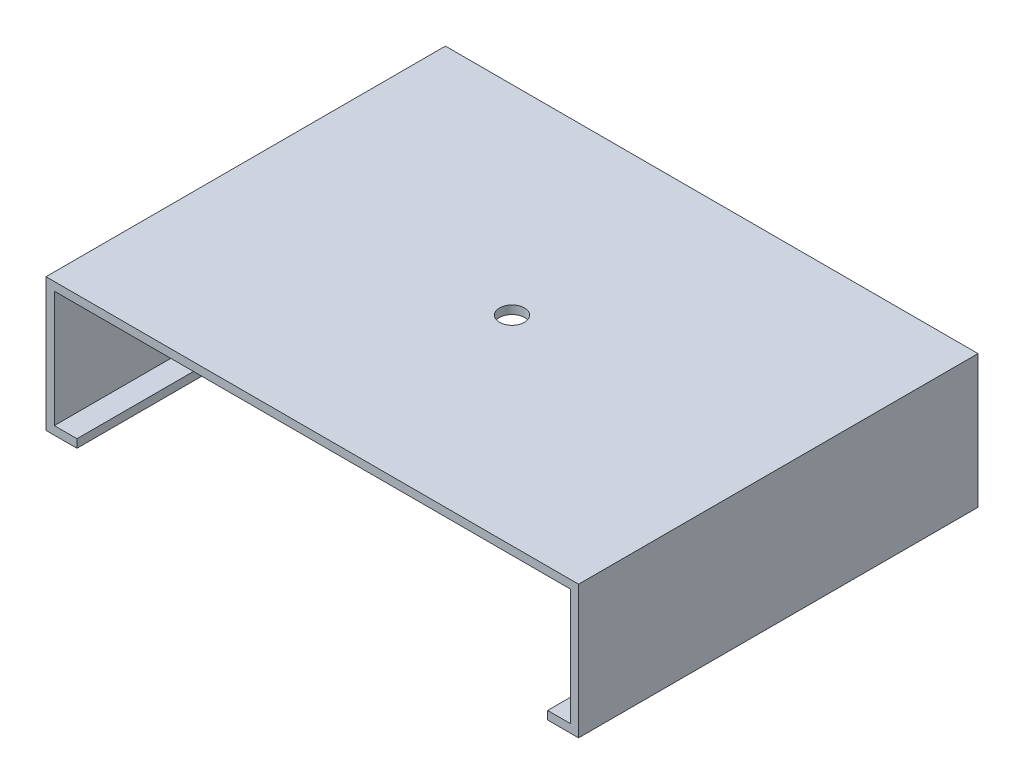
ISO-10303-21;
HEADER;
FILE_DESCRIPTION(('STEP AP214'),'2;1');
FILE_NAME('part.step','',(''),(''),'','','');
FILE_SCHEMA(('AUTOMOTIVE_DESIGN { 1 0 10303 214 1 1 1 1 }'));
ENDSEC;
DATA;
#1=APPLICATION_CONTEXT('core data for automotive mechanical design processes');
#2=APPLICATION_PROTOCOL_DEFINITION('international standard','automotive_design',2000,#1);
#3=PRODUCT_CONTEXT('',#1,'mechanical');
#4=PRODUCT('Part','Part','',(#3));
#5=PRODUCT_RELATED_PRODUCT_CATEGORY('part','',(#4));
#6=PRODUCT_DEFINITION_FORMATION('','',#4);
#7=PRODUCT_DEFINITION_CONTEXT('part definition',#1,'design');
#8=PRODUCT_DEFINITION('design','',#6,#7);
#9=PRODUCT_DEFINITION_SHAPE('','',#8);
#10=(LENGTH_UNIT() NAMED_UNIT(*) SI_UNIT(.MILLI.,.METRE.));
#11=(NAMED_UNIT(*) PLANE_ANGLE_UNIT() SI_UNIT($,.RADIAN.));
#12=(NAMED_UNIT(*) SI_UNIT($,.STERADIAN.) SOLID_ANGLE_UNIT());
#13=UNCERTAINTY_MEASURE_WITH_UNIT(LENGTH_MEASURE(1.E-05),#10,'distance_accuracy_value','');
#14=(GEOMETRIC_REPRESENTATION_CONTEXT(3) GLOBAL_UNCERTAINTY_ASSIGNED_CONTEXT((#13)) GLOBAL_UNIT_ASSIGNED_CONTEXT((#10,
#11,#12)) REPRESENTATION_CONTEXT('',''));
#15=CARTESIAN_POINT('',(0.,0.,0.));
#16=DIRECTION('',(0.,0.,1.));
#17=DIRECTION('',(1.,0.,0.));
#18=AXIS2_PLACEMENT_3D('',#15,#16,#17);
#19=CARTESIAN_POINT('',(-101.6,-25.4,152.4));
#20=DIRECTION('',(0.,1.,0.));
#21=DIRECTION('',(0.,0.,1.));
#22=AXIS2_PLACEMENT_3D('',#19,#20,#21);
#23=PLANE('',#22);
#24=DIRECTION('',(1.,0.,0.));
#25=VECTOR('',#24,1.);
#26=CARTESIAN_POINT('',(-101.6,-25.4,0.));
#27=LINE('',#26,#25);
#28=CARTESIAN_POINT('',(-101.6,-25.4,0.));
#29=VERTEX_POINT('',#28);
#30=CARTESIAN_POINT('',(-89.789,-25.4,0.));
#31=VERTEX_POINT('',#30);
#32=EDGE_CURVE('E176',#29,#31,#27,.T.);
#33=ORIENTED_EDGE('',*,*,#32,.T.);
#34=DIRECTION('',(0.,0.,-1.));
#35=VECTOR('',#34,1.);
#36=CARTESIAN_POINT('',(-89.789,-25.4,0.));
#37=LINE('',#36,#35);
#38=CARTESIAN_POINT('',(-89.789,-25.4,152.4));
#39=VERTEX_POINT('',#38);
#40=EDGE_CURVE('E138',#39,#31,#37,.T.);
#41=ORIENTED_EDGE('',*,*,#40,.F.);
#42=DIRECTION('',(1.,0.,0.));
#43=VECTOR('',#42,1.);
#44=CARTESIAN_POINT('',(-101.6,-25.4,152.4));
#45=LINE('',#44,#43);
#46=CARTESIAN_POINT('',(-101.6,-25.4,152.4));
#47=VERTEX_POINT('',#46);
#48=EDGE_CURVE('E137',#47,#39,#45,.T.);
#49=ORIENTED_EDGE('',*,*,#48,.F.);
#50=DIRECTION('',(0.,0.,-1.));
#51=VECTOR('',#50,1.);
#52=CARTESIAN_POINT('',(-101.6,-25.4,152.4));
#53=LINE('',#52,#51);
#54=EDGE_CURVE('E194',#47,#29,#53,.T.);
#55=ORIENTED_EDGE('',*,*,#54,.T.);
#56=EDGE_LOOP('',(#33,#41,#49,#55));
#57=FACE_BOUND('',#56,.T.);
#58=ADVANCED_FACE('F33',(#57),#23,.F.);
#59=CARTESIAN_POINT('',(-98.425,-22.225,152.4));
#60=DIRECTION('',(0.,1.,0.));
#61=DIRECTION('',(0.,0.,1.));
#62=AXIS2_PLACEMENT_3D('',#59,#60,#61);
#63=PLANE('',#62);
#64=DIRECTION('',(0.,0.,-1.));
#65=VECTOR('',#64,1.);
#66=CARTESIAN_POINT('',(-89.789,-22.225,0.));
#67=LINE('',#66,#65);
#68=CARTESIAN_POINT('',(-89.789,-22.225,152.4));
#69=VERTEX_POINT('',#68);
#70=CARTESIAN_POINT('',(-89.789,-22.225,0.));
#71=VERTEX_POINT('',#70);
#72=EDGE_CURVE('E120',#69,#71,#67,.T.);
#73=ORIENTED_EDGE('',*,*,#72,.T.);
#74=DIRECTION('',(1.,0.,0.));
#75=VECTOR('',#74,1.);
#76=CARTESIAN_POINT('',(-98.425,-22.225,0.));
#77=LINE('',#76,#75);
#78=CARTESIAN_POINT('',(-98.425,-22.225,0.));
#79=VERTEX_POINT('',#78);
#80=EDGE_CURVE('E162',#79,#71,#77,.T.);
#81=ORIENTED_EDGE('',*,*,#80,.F.);
#82=DIRECTION('',(0.,0.,-1.));
#83=VECTOR('',#82,1.);
#84=CARTESIAN_POINT('',(-98.425,-22.225,152.4));
#85=LINE('',#84,#83);
#86=CARTESIAN_POINT('',(-98.425,-22.225,152.4));
#87=VERTEX_POINT('',#86);
#88=EDGE_CURVE('E141',#87,#79,#85,.T.);
#89=ORIENTED_EDGE('',*,*,#88,.F.);
#90=DIRECTION('',(1.,0.,0.));
#91=VECTOR('',#90,1.);
#92=CARTESIAN_POINT('',(-98.425,-22.225,152.4));
#93=LINE('',#92,#91);
#94=EDGE_CURVE('E135',#87,#69,#93,.T.);
#95=ORIENTED_EDGE('',*,*,#94,.T.);
#96=EDGE_LOOP('',(#73,#81,#89,#95));
#97=FACE_BOUND('',#96,.T.);
#98=ADVANCED_FACE('F140',(#97),#63,.T.);
#99=CARTESIAN_POINT('',(0.,0.,152.4));
#100=DIRECTION('',(0.,0.,1.));
#101=DIRECTION('',(1.,0.,0.));
#102=AXIS2_PLACEMENT_3D('',#99,#100,#101);
#103=PLANE('',#102);
#104=DIRECTION('',(0.,-1.,0.));
#105=VECTOR('',#104,1.);
#106=CARTESIAN_POINT('',(-89.789,213.304229786878,152.4));
#107=LINE('',#106,#105);
#108=EDGE_CURVE('E123',#69,#39,#107,.T.);
#109=ORIENTED_EDGE('',*,*,#108,.F.);
#110=ORIENTED_EDGE('',*,*,#94,.F.);
#111=DIRECTION('',(0.,-1.,0.));
#112=VECTOR('',#111,1.);
#113=CARTESIAN_POINT('',(-98.425,22.225,152.4));
#114=LINE('',#113,#112);
#115=CARTESIAN_POINT('',(-98.425,22.225,152.4));
#116=VERTEX_POINT('',#115);
#117=EDGE_CURVE('E148',#116,#87,#114,.T.);
#118=ORIENTED_EDGE('',*,*,#117,.F.);
#119=DIRECTION('',(-1.,0.,0.));
#120=VECTOR('',#119,1.);
#121=CARTESIAN_POINT('',(-98.425,22.225,152.4));
#122=LINE('',#121,#120);
#123=CARTESIAN_POINT('',(98.425,22.225,152.4));
#124=VERTEX_POINT('',#123);
#125=EDGE_CURVE('E222',#124,#116,#122,.T.);
#126=ORIENTED_EDGE('',*,*,#125,.F.);
#127=DIRECTION('',(0.,1.,0.));
#128=VECTOR('',#127,1.);
#129=CARTESIAN_POINT('',(98.425,22.225,152.4));
#130=LINE('',#129,#128);
#131=CARTESIAN_POINT('',(98.425,-22.225,152.4));
#132=VERTEX_POINT('',#131);
#133=EDGE_CURVE('E163',#132,#124,#130,.T.);
#134=ORIENTED_EDGE('',*,*,#133,.F.);
#135=CARTESIAN_POINT('',(89.789,-22.225,152.4));
#136=VERTEX_POINT('',#135);
#137=EDGE_CURVE('E144',#136,#132,#93,.T.);
#138=ORIENTED_EDGE('',*,*,#137,.F.);
#139=DIRECTION('',(0.,-1.,0.));
#140=VECTOR('',#139,1.);
#141=CARTESIAN_POINT('',(89.789,213.304229786878,152.4));
#142=LINE('',#141,#140);
#143=CARTESIAN_POINT('',(89.789,-25.4,152.4));
#144=VERTEX_POINT('',#143);
#145=EDGE_CURVE('E49',#136,#144,#142,.T.);
#146=ORIENTED_EDGE('',*,*,#145,.T.);
#147=CARTESIAN_POINT('',(101.6,-25.4,152.4));
#148=VERTEX_POINT('',#147);
#149=EDGE_CURVE('E180',#144,#148,#45,.T.);
#150=ORIENTED_EDGE('',*,*,#149,.T.);
#151=DIRECTION('',(0.,1.,0.));
#152=VECTOR('',#151,1.);
#153=CARTESIAN_POINT('',(101.6,25.4,152.4));
#154=LINE('',#153,#152);
#155=CARTESIAN_POINT('',(101.6,25.4,152.4));
#156=VERTEX_POINT('',#155);
#157=EDGE_CURVE('E172',#148,#156,#154,.T.);
#158=ORIENTED_EDGE('',*,*,#157,.T.);
#159=DIRECTION('',(-1.,0.,0.));
#160=VECTOR('',#159,1.);
#161=CARTESIAN_POINT('',(-101.6,25.4,152.4));
#162=LINE('',#161,#160);
#163=CARTESIAN_POINT('',(-101.6,25.4,152.4));
#164=VERTEX_POINT('',#163);
#165=EDGE_CURVE('E175',#156,#164,#162,.T.);
#166=ORIENTED_EDGE('',*,*,#165,.T.);
#167=DIRECTION('',(0.,-1.,0.));
#168=VECTOR('',#167,1.);
#169=CARTESIAN_POINT('',(-101.6,25.4,152.4));
#170=LINE('',#169,#168);
#171=EDGE_CURVE('E178',#164,#47,#170,.T.);
#172=ORIENTED_EDGE('',*,*,#171,.T.);
#173=ORIENTED_EDGE('',*,*,#48,.T.);
#174=EDGE_LOOP('',(#109,#110,#118,#126,#134,#138,#146,#150,#158,#166,#172,#173));
#175=FACE_BOUND('',#174,.T.);
#176=ADVANCED_FACE('F133',(#175),#103,.T.);
#177=CARTESIAN_POINT('',(0.,0.,0.));
#178=DIRECTION('',(0.,0.,1.));
#179=DIRECTION('',(1.,0.,0.));
#180=AXIS2_PLACEMENT_3D('',#177,#178,#179);
#181=PLANE('',#180);
#182=ORIENTED_EDGE('',*,*,#80,.T.);
#183=DIRECTION('',(0.,-1.,0.));
#184=VECTOR('',#183,1.);
#185=CARTESIAN_POINT('',(-89.789,213.304229786878,0.));
#186=LINE('',#185,#184);
#187=EDGE_CURVE('E57',#71,#31,#186,.T.);
#188=ORIENTED_EDGE('',*,*,#187,.T.);
#189=ORIENTED_EDGE('',*,*,#32,.F.);
#190=DIRECTION('',(0.,-1.,0.));
#191=VECTOR('',#190,1.);
#192=CARTESIAN_POINT('',(-101.6,25.4,0.));
#193=LINE('',#192,#191);
#194=CARTESIAN_POINT('',(-101.6,25.4,0.));
#195=VERTEX_POINT('',#194);
#196=EDGE_CURVE('E187',#195,#29,#193,.T.);
#197=ORIENTED_EDGE('',*,*,#196,.F.);
#198=DIRECTION('',(-1.,0.,0.));
#199=VECTOR('',#198,1.);
#200=CARTESIAN_POINT('',(-101.6,25.4,0.));
#201=LINE('',#200,#199);
#202=CARTESIAN_POINT('',(101.6,25.4,0.));
#203=VERTEX_POINT('',#202);
#204=EDGE_CURVE('E185',#203,#195,#201,.T.);
#205=ORIENTED_EDGE('',*,*,#204,.F.);
#206=DIRECTION('',(0.,1.,0.));
#207=VECTOR('',#206,1.);
#208=CARTESIAN_POINT('',(101.6,25.4,0.));
#209=LINE('',#208,#207);
#210=CARTESIAN_POINT('',(101.6,-25.4,0.));
#211=VERTEX_POINT('',#210);
#212=EDGE_CURVE('E171',#211,#203,#209,.T.);
#213=ORIENTED_EDGE('',*,*,#212,.F.);
#214=CARTESIAN_POINT('',(89.789,-25.4,0.));
#215=VERTEX_POINT('',#214);
#216=EDGE_CURVE('E189',#215,#211,#27,.T.);
#217=ORIENTED_EDGE('',*,*,#216,.F.);
#218=DIRECTION('',(0.,-1.,0.));
#219=VECTOR('',#218,1.);
#220=CARTESIAN_POINT('',(89.789,213.304229786878,0.));
#221=LINE('',#220,#219);
#222=CARTESIAN_POINT('',(89.789,-22.225,0.));
#223=VERTEX_POINT('',#222);
#224=EDGE_CURVE('E217',#223,#215,#221,.T.);
#225=ORIENTED_EDGE('',*,*,#224,.F.);
#226=CARTESIAN_POINT('',(98.425,-22.225,0.));
#227=VERTEX_POINT('',#226);
#228=EDGE_CURVE('E161',#223,#227,#77,.T.);
#229=ORIENTED_EDGE('',*,*,#228,.T.);
#230=DIRECTION('',(0.,1.,0.));
#231=VECTOR('',#230,1.);
#232=CARTESIAN_POINT('',(98.425,22.225,0.));
#233=LINE('',#232,#231);
#234=CARTESIAN_POINT('',(98.425,22.225,0.));
#235=VERTEX_POINT('',#234);
#236=EDGE_CURVE('E152',#227,#235,#233,.T.);
#237=ORIENTED_EDGE('',*,*,#236,.T.);
#238=DIRECTION('',(-1.,0.,0.));
#239=VECTOR('',#238,1.);
#240=CARTESIAN_POINT('',(-98.425,22.225,0.));
#241=LINE('',#240,#239);
#242=CARTESIAN_POINT('',(-98.425,22.225,0.));
#243=VERTEX_POINT('',#242);
#244=EDGE_CURVE('E155',#235,#243,#241,.T.);
#245=ORIENTED_EDGE('',*,*,#244,.T.);
#246=DIRECTION('',(0.,-1.,0.));
#247=VECTOR('',#246,1.);
#248=CARTESIAN_POINT('',(-98.425,22.225,0.));
#249=LINE('',#248,#247);
#250=EDGE_CURVE('E158',#243,#79,#249,.T.);
#251=ORIENTED_EDGE('',*,*,#250,.T.);
#252=EDGE_LOOP('',(#182,#188,#189,#197,#205,#213,#217,#225,#229,#237,#245,#251));
#253=FACE_BOUND('',#252,.T.);
#254=ADVANCED_FACE('F207',(#253),#181,.F.);
#255=CARTESIAN_POINT('',(101.6,25.4,152.4));
#256=DIRECTION('',(-1.,0.,0.));
#257=DIRECTION('',(0.,0.,1.));
#258=AXIS2_PLACEMENT_3D('',#255,#256,#257);
#259=PLANE('',#258);
#260=ORIENTED_EDGE('',*,*,#212,.T.);
#261=DIRECTION('',(0.,0.,-1.));
#262=VECTOR('',#261,1.);
#263=CARTESIAN_POINT('',(101.6,25.4,152.4));
#264=LINE('',#263,#262);
#265=EDGE_CURVE('E11',#156,#203,#264,.T.);
#266=ORIENTED_EDGE('',*,*,#265,.F.);
#267=ORIENTED_EDGE('',*,*,#157,.F.);
#268=DIRECTION('',(0.,0.,-1.));
#269=VECTOR('',#268,1.);
#270=CARTESIAN_POINT('',(101.6,-25.4,152.4));
#271=LINE('',#270,#269);
#272=EDGE_CURVE('E182',#148,#211,#271,.T.);
#273=ORIENTED_EDGE('',*,*,#272,.T.);
#274=EDGE_LOOP('',(#260,#266,#267,#273));
#275=FACE_BOUND('',#274,.T.);
#276=ADVANCED_FACE('F35',(#275),#259,.F.);
#277=CARTESIAN_POINT('',(-101.6,25.4,152.4));
#278=DIRECTION('',(0.,-1.,0.));
#279=DIRECTION('',(0.,0.,-1.));
#280=AXIS2_PLACEMENT_3D('',#277,#278,#279);
#281=PLANE('',#280);
#282=CARTESIAN_POINT('',(0.,25.4,76.2));
#283=DIRECTION('',(0.,1.,0.));
#284=DIRECTION('',(0.,0.,1.));
#285=AXIS2_PLACEMENT_3D('',#282,#283,#284);
#286=CIRCLE('',#285,4.7625);
#287=CARTESIAN_POINT('',(0.,25.4,80.9625));
#288=VERTEX_POINT('',#287);
#289=EDGE_CURVE('E214',#288,#288,#286,.T.);
#290=ORIENTED_EDGE('',*,*,#289,.F.);
#291=EDGE_LOOP('',(#290));
#292=FACE_BOUND('',#291,.T.);
#293=ORIENTED_EDGE('',*,*,#204,.T.);
#294=DIRECTION('',(0.,0.,-1.));
#295=VECTOR('',#294,1.);
#296=CARTESIAN_POINT('',(-101.6,25.4,152.4));
#297=LINE('',#296,#295);
#298=EDGE_CURVE('E42',#164,#195,#297,.T.);
#299=ORIENTED_EDGE('',*,*,#298,.F.);
#300=ORIENTED_EDGE('',*,*,#165,.F.);
#301=ORIENTED_EDGE('',*,*,#265,.T.);
#302=EDGE_LOOP('',(#293,#299,#300,#301));
#303=FACE_BOUND('',#302,.T.);
#304=ADVANCED_FACE('F251',(#292,#303),#281,.F.);
#305=CARTESIAN_POINT('',(-101.6,25.4,152.4));
#306=DIRECTION('',(1.,0.,0.));
#307=DIRECTION('',(0.,0.,-1.));
#308=AXIS2_PLACEMENT_3D('',#305,#306,#307);
#309=PLANE('',#308);
#310=ORIENTED_EDGE('',*,*,#196,.T.);
#311=ORIENTED_EDGE('',*,*,#54,.F.);
#312=ORIENTED_EDGE('',*,*,#171,.F.);
#313=ORIENTED_EDGE('',*,*,#298,.T.);
#314=EDGE_LOOP('',(#310,#311,#312,#313));
#315=FACE_BOUND('',#314,.T.);
#316=ADVANCED_FACE('F202',(#315),#309,.F.);
#317=ORIENTED_EDGE('',*,*,#149,.F.);
#318=DIRECTION('',(0.,0.,1.));
#319=VECTOR('',#318,1.);
#320=CARTESIAN_POINT('',(89.789,-25.4,0.));
#321=LINE('',#320,#319);
#322=EDGE_CURVE('E210',#215,#144,#321,.T.);
#323=ORIENTED_EDGE('',*,*,#322,.F.);
#324=ORIENTED_EDGE('',*,*,#216,.T.);
#325=ORIENTED_EDGE('',*,*,#272,.F.);
#326=EDGE_LOOP('',(#317,#323,#324,#325));
#327=FACE_BOUND('',#326,.T.);
#328=ADVANCED_FACE('F247',(#327),#23,.F.);
#329=CARTESIAN_POINT('',(98.425,22.225,152.4));
#330=DIRECTION('',(-1.,0.,0.));
#331=DIRECTION('',(0.,0.,1.));
#332=AXIS2_PLACEMENT_3D('',#329,#330,#331);
#333=PLANE('',#332);
#334=ORIENTED_EDGE('',*,*,#236,.F.);
#335=DIRECTION('',(0.,0.,-1.));
#336=VECTOR('',#335,1.);
#337=CARTESIAN_POINT('',(98.425,-22.225,152.4));
#338=LINE('',#337,#336);
#339=EDGE_CURVE('E143',#132,#227,#338,.T.);
#340=ORIENTED_EDGE('',*,*,#339,.F.);
#341=ORIENTED_EDGE('',*,*,#133,.T.);
#342=DIRECTION('',(0.,0.,-1.));
#343=VECTOR('',#342,1.);
#344=CARTESIAN_POINT('',(98.425,22.225,152.4));
#345=LINE('',#344,#343);
#346=EDGE_CURVE('E168',#124,#235,#345,.T.);
#347=ORIENTED_EDGE('',*,*,#346,.T.);
#348=EDGE_LOOP('',(#334,#340,#341,#347));
#349=FACE_BOUND('',#348,.T.);
#350=ADVANCED_FACE('F235',(#349),#333,.T.);
#351=CARTESIAN_POINT('',(-98.425,22.225,152.4));
#352=DIRECTION('',(0.,-1.,0.));
#353=DIRECTION('',(0.,0.,-1.));
#354=AXIS2_PLACEMENT_3D('',#351,#352,#353);
#355=PLANE('',#354);
#356=CARTESIAN_POINT('',(0.,22.225,76.2));
#357=DIRECTION('',(0.,-1.,0.));
#358=DIRECTION('',(0.,0.,-1.));
#359=AXIS2_PLACEMENT_3D('',#356,#357,#358);
#360=CIRCLE('',#359,4.7625);
#361=CARTESIAN_POINT('',(0.,22.225,71.4375));
#362=VERTEX_POINT('',#361);
#363=EDGE_CURVE('E37',#362,#362,#360,.T.);
#364=ORIENTED_EDGE('',*,*,#363,.F.);
#365=EDGE_LOOP('',(#364));
#366=FACE_BOUND('',#365,.T.);
#367=ORIENTED_EDGE('',*,*,#244,.F.);
#368=ORIENTED_EDGE('',*,*,#346,.F.);
#369=ORIENTED_EDGE('',*,*,#125,.T.);
#370=DIRECTION('',(0.,0.,-1.));
#371=VECTOR('',#370,1.);
#372=CARTESIAN_POINT('',(-98.425,22.225,152.4));
#373=LINE('',#372,#371);
#374=EDGE_CURVE('E166',#116,#243,#373,.T.);
#375=ORIENTED_EDGE('',*,*,#374,.T.);
#376=EDGE_LOOP('',(#367,#368,#369,#375));
#377=FACE_BOUND('',#376,.T.);
#378=ADVANCED_FACE('F236',(#366,#377),#355,.T.);
#379=CARTESIAN_POINT('',(-98.425,22.225,152.4));
#380=DIRECTION('',(1.,0.,0.));
#381=DIRECTION('',(0.,1.,0.));
#382=AXIS2_PLACEMENT_3D('',#379,#380,#381);
#383=PLANE('',#382);
#384=ORIENTED_EDGE('',*,*,#250,.F.);
#385=ORIENTED_EDGE('',*,*,#374,.F.);
#386=ORIENTED_EDGE('',*,*,#117,.T.);
#387=ORIENTED_EDGE('',*,*,#88,.T.);
#388=EDGE_LOOP('',(#384,#385,#386,#387));
#389=FACE_BOUND('',#388,.T.);
#390=ADVANCED_FACE('F229',(#389),#383,.T.);
#391=DIRECTION('',(0.,0.,1.));
#392=VECTOR('',#391,1.);
#393=CARTESIAN_POINT('',(89.789,-22.225,0.));
#394=LINE('',#393,#392);
#395=EDGE_CURVE('E216',#223,#136,#394,.T.);
#396=ORIENTED_EDGE('',*,*,#395,.T.);
#397=ORIENTED_EDGE('',*,*,#137,.T.);
#398=ORIENTED_EDGE('',*,*,#339,.T.);
#399=ORIENTED_EDGE('',*,*,#228,.F.);
#400=EDGE_LOOP('',(#396,#397,#398,#399));
#401=FACE_BOUND('',#400,.T.);
#402=ADVANCED_FACE('F240',(#401),#63,.T.);
#403=CARTESIAN_POINT('',(89.789,213.304229786878,0.));
#404=DIRECTION('',(1.,0.,0.));
#405=DIRECTION('',(0.,0.,-1.));
#406=AXIS2_PLACEMENT_3D('',#403,#404,#405);
#407=PLANE('',#406);
#408=ORIENTED_EDGE('',*,*,#224,.T.);
#409=ORIENTED_EDGE('',*,*,#322,.T.);
#410=ORIENTED_EDGE('',*,*,#145,.F.);
#411=ORIENTED_EDGE('',*,*,#395,.F.);
#412=EDGE_LOOP('',(#408,#409,#410,#411));
#413=FACE_BOUND('',#412,.T.);
#414=ADVANCED_FACE('F241',(#413),#407,.F.);
#415=CARTESIAN_POINT('',(-89.789,213.304229786878,0.));
#416=DIRECTION('',(-1.,0.,0.));
#417=DIRECTION('',(0.,0.,1.));
#418=AXIS2_PLACEMENT_3D('',#415,#416,#417);
#419=PLANE('',#418);
#420=ORIENTED_EDGE('',*,*,#108,.T.);
#421=ORIENTED_EDGE('',*,*,#40,.T.);
#422=ORIENTED_EDGE('',*,*,#187,.F.);
#423=ORIENTED_EDGE('',*,*,#72,.F.);
#424=EDGE_LOOP('',(#420,#421,#422,#423));
#425=FACE_BOUND('',#424,.T.);
#426=ADVANCED_FACE('F122',(#425),#419,.F.);
#427=CARTESIAN_POINT('',(0.,-25.4,76.2));
#428=DIRECTION('',(0.,1.,0.));
#429=DIRECTION('',(0.,0.,1.));
#430=AXIS2_PLACEMENT_3D('',#427,#428,#429);
#431=CYLINDRICAL_SURFACE('',#430,4.7625);
#432=ORIENTED_EDGE('',*,*,#363,.T.);
#433=EDGE_LOOP('',(#432));
#434=FACE_BOUND('',#433,.T.);
#435=ORIENTED_EDGE('',*,*,#289,.T.);
#436=EDGE_LOOP('',(#435));
#437=FACE_BOUND('',#436,.T.);
#438=ADVANCED_FACE('F349',(#434,#437),#431,.F.);
#439=CLOSED_SHELL('',(#58,#98,#176,#254,#276,#304,#316,#328,#350,#378,#390,#402,#414,#426,#438));
#440=MANIFOLD_SOLID_BREP('B2',#439);
#441=ADVANCED_BREP_SHAPE_REPRESENTATION('',(#18,#440),#14);
#442=SHAPE_DEFINITION_REPRESENTATION(#9,#441);
ENDSEC;
END-ISO-10303-21;
